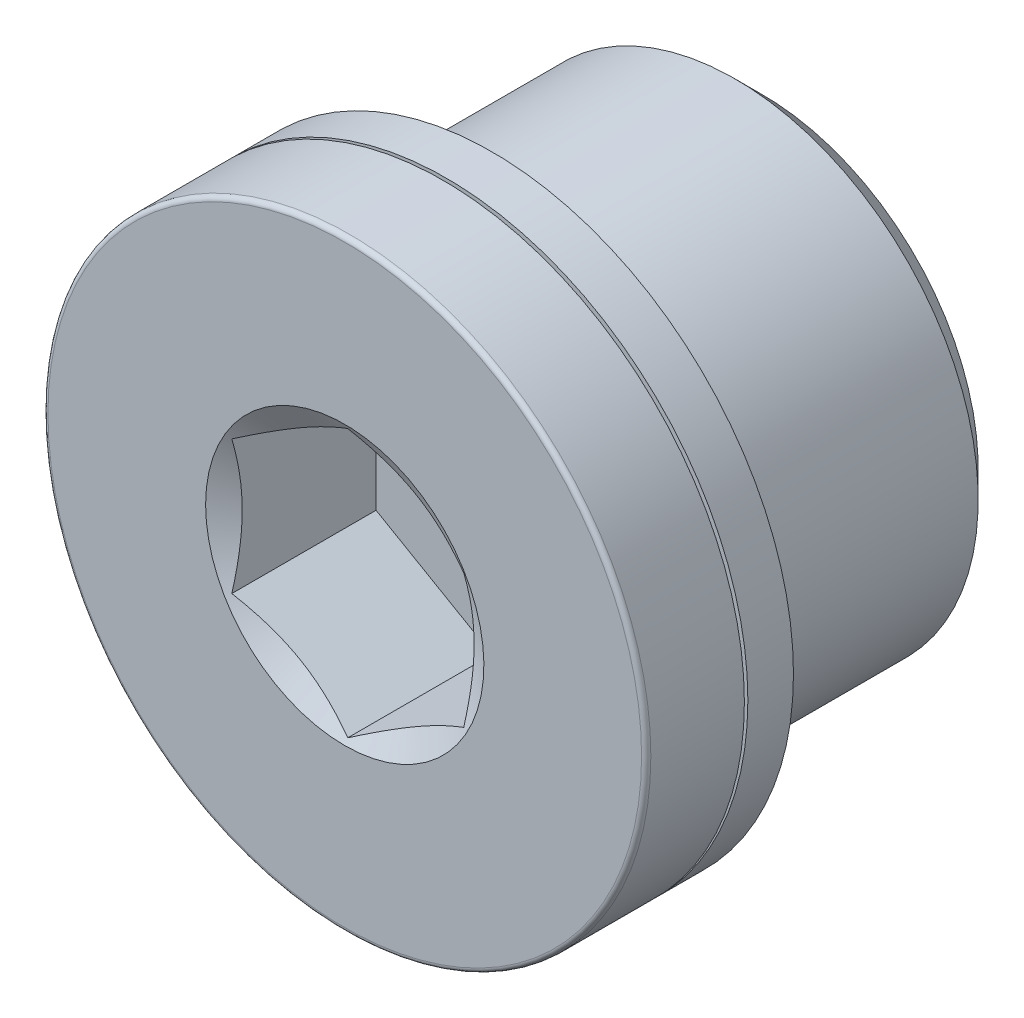
ISO-10303-21;
HEADER;
FILE_DESCRIPTION(('STEP AP214'),'2;1');
FILE_NAME('part.step','',(''),(''),'','','');
FILE_SCHEMA(('AUTOMOTIVE_DESIGN { 1 0 10303 214 1 1 1 1 }'));
ENDSEC;
DATA;
#1=APPLICATION_CONTEXT('core data for automotive mechanical design processes');
#2=APPLICATION_PROTOCOL_DEFINITION('international standard','automotive_design',2000,#1);
#3=PRODUCT_CONTEXT('',#1,'mechanical');
#4=PRODUCT('Part','Part','',(#3));
#5=PRODUCT_RELATED_PRODUCT_CATEGORY('part','',(#4));
#6=PRODUCT_DEFINITION_FORMATION('','',#4);
#7=PRODUCT_DEFINITION_CONTEXT('part definition',#1,'design');
#8=PRODUCT_DEFINITION('design','',#6,#7);
#9=PRODUCT_DEFINITION_SHAPE('','',#8);
#10=(LENGTH_UNIT() NAMED_UNIT(*) SI_UNIT(.MILLI.,.METRE.));
#11=(NAMED_UNIT(*) PLANE_ANGLE_UNIT() SI_UNIT($,.RADIAN.));
#12=(NAMED_UNIT(*) SI_UNIT($,.STERADIAN.) SOLID_ANGLE_UNIT());
#13=UNCERTAINTY_MEASURE_WITH_UNIT(LENGTH_MEASURE(1.E-05),#10,'distance_accuracy_value','');
#14=(GEOMETRIC_REPRESENTATION_CONTEXT(3) GLOBAL_UNCERTAINTY_ASSIGNED_CONTEXT((#13)) GLOBAL_UNIT_ASSIGNED_CONTEXT((#10,
#11,#12)) REPRESENTATION_CONTEXT('',''));
#15=CARTESIAN_POINT('',(0.,0.,0.));
#16=DIRECTION('',(0.,0.,1.));
#17=DIRECTION('',(1.,0.,0.));
#18=AXIS2_PLACEMENT_3D('',#15,#16,#17);
#19=CARTESIAN_POINT('',(0.,0.,2.88589838486224));
#20=DIRECTION('',(0.,0.,1.));
#21=DIRECTION('',(1.,0.,0.));
#22=AXIS2_PLACEMENT_3D('',#19,#20,#21);
#23=CONICAL_SURFACE('',#22,0.,1.0471975511966);
#24=CARTESIAN_POINT('',(0.,0.,6.35));
#25=DIRECTION('',(0.,0.,-1.));
#26=DIRECTION('',(-1.,0.,0.));
#27=AXIS2_PLACEMENT_3D('',#24,#25,#26);
#28=CIRCLE('',#27,6.);
#29=CARTESIAN_POINT('',(-6.,0.,6.35));
#30=VERTEX_POINT('',#29);
#31=EDGE_CURVE('E152',#30,#30,#28,.T.);
#32=ORIENTED_EDGE('',*,*,#31,.F.);
#33=EDGE_LOOP('',(#32));
#34=FACE_BOUND('',#33,.T.);
#35=CARTESIAN_POINT('',(-5.,-7.51498291576672,8.09726315250439));
#36=CARTESIAN_POINT('',(-5.,-7.29839682441269,7.9931853972235));
#37=CARTESIAN_POINT('',(-5.,-7.08128679067715,7.8901778184765));
#38=CARTESIAN_POINT('',(-5.,-6.64573899269538,7.6869106646106));
#39=CARTESIAN_POINT('',(-5.,-6.4273010008053,7.58665157786321));
#40=CARTESIAN_POINT('',(-5.,-5.98757322821237,7.38893249271981));
#41=CARTESIAN_POINT('',(-5.,-5.76627419510122,7.29149299495007));
#42=CARTESIAN_POINT('',(-5.,-5.32182876710889,7.10093846332174));
#43=CARTESIAN_POINT('',(-5.,-5.09868246827946,7.00782320626038));
#44=CARTESIAN_POINT('',(-5.,-4.64416259436984,6.82463959555632));
#45=CARTESIAN_POINT('',(-5.,-4.41272880244035,6.73471978137861));
#46=CARTESIAN_POINT('',(-5.,-3.94706741806007,6.56228336081755));
#47=CARTESIAN_POINT('',(-5.,-3.71283950408459,6.47976761592815));
#48=CARTESIAN_POINT('',(-5.,-3.24173832846906,6.32448137218276));
#49=CARTESIAN_POINT('',(-5.,-3.00487238668021,6.25168890461042));
#50=CARTESIAN_POINT('',(-5.,-2.52775604069386,6.11833937787826));
#51=CARTESIAN_POINT('',(-5.,-2.28750680326715,6.05777820603802));
#52=CARTESIAN_POINT('',(-5.,-1.80467662895432,5.95223314778336));
#53=CARTESIAN_POINT('',(-5.,-1.56211102340034,5.90718047816048));
#54=CARTESIAN_POINT('',(-5.,-1.07423325022016,5.83538707071728));
#55=CARTESIAN_POINT('',(-5.,-0.828921279391307,5.80864502923382));
#56=CARTESIAN_POINT('',(-5.,-0.339867234671963,5.77595532488155));
#57=CARTESIAN_POINT('',(-5.,-0.0961421499745084,5.76975964809213));
#58=CARTESIAN_POINT('',(-5.,0.390971712858013,5.77804856183829));
#59=CARTESIAN_POINT('',(-5.,0.634360470091799,5.79253438446762));
#60=CARTESIAN_POINT('',(-5.,1.05491312498942,5.83445216890555));
#61=CARTESIAN_POINT('',(-5.,1.23254199575583,5.85743855624536));
#62=CARTESIAN_POINT('',(-5.,1.58633032077231,5.91285916908837));
#63=CARTESIAN_POINT('',(-5.,1.76248953847734,5.94529488642275));
#64=CARTESIAN_POINT('',(-5.,2.28861525361025,6.05505238737444));
#65=CARTESIAN_POINT('',(-5.,2.63600942643604,6.14479982703772));
#66=CARTESIAN_POINT('',(-5.,3.15545267799602,6.29833259167404));
#67=CARTESIAN_POINT('',(-5.,3.33023614750218,6.35337541202317));
#68=CARTESIAN_POINT('',(-5.,3.67810293868774,6.46864160831348));
#69=CARTESIAN_POINT('',(-5.,3.8511862481301,6.528865021512));
#70=CARTESIAN_POINT('',(-5.,4.19572089434447,6.65357082288413));
#71=CARTESIAN_POINT('',(-5.,4.36717284596877,6.71805152734705));
#72=CARTESIAN_POINT('',(-5.,4.70869043500968,6.85056712253771));
#73=CARTESIAN_POINT('',(-5.,4.87875609600722,6.91860195266298));
#74=CARTESIAN_POINT('',(-5.,5.31566032178151,7.0978154516773));
#75=CARTESIAN_POINT('',(-5.,5.58159535709204,7.21119406765364));
#76=CARTESIAN_POINT('',(-5.,6.11103777091063,7.44350143076095));
#77=CARTESIAN_POINT('',(-5.,6.37454495892792,7.56243060902696));
#78=CARTESIAN_POINT('',(-5.,6.89965417045417,7.80457959466809));
#79=CARTESIAN_POINT('',(-5.,7.16125570501509,7.92780045934609));
#80=CARTESIAN_POINT('',(-5.,7.68286959339868,8.17756710133894));
#81=CARTESIAN_POINT('',(-5.,7.94288191064873,8.30411295481925));
#82=CARTESIAN_POINT('',(-5.,8.46192247473481,8.55998755665902));
#83=CARTESIAN_POINT('',(-5.,8.72094915014142,8.68931948707651));
#84=CARTESIAN_POINT('',(-5.,9.23793498576547,8.95010158025791));
#85=CARTESIAN_POINT('',(-5.,9.49589413699256,9.08155176081562));
#86=CARTESIAN_POINT('',(-5.,10.2683731632483,9.47841849938881));
#87=CARTESIAN_POINT('',(-5.,10.7815784831789,9.74639294927315));
#88=CARTESIAN_POINT('',(-5.,11.756570283339,10.2611299291552));
#89=CARTESIAN_POINT('',(-5.,12.2185806064612,10.507470284507));
#90=CARTESIAN_POINT('',(-5.,13.141115497133,11.0029645718297));
#91=CARTESIAN_POINT('',(-5.,13.6016399981462,11.2521186276124));
#92=CARTESIAN_POINT('',(-5.,14.5203444470608,11.7518767761664));
#93=CARTESIAN_POINT('',(-5.,14.9785273772632,12.0024753944819));
#94=CARTESIAN_POINT('',(-5.,15.8939640853943,12.5053003910811));
#95=CARTESIAN_POINT('',(-5.,16.3512179169289,12.7575266717331));
#96=CARTESIAN_POINT('',(-5.,16.8081395102917,13.0103498728431));
#97=B_SPLINE_CURVE_WITH_KNOTS('',3,(#35,#36,#37,#38,#39,#40,#41,#42,#43,#44,#45,#46,#47,#48,#49,
#50,#51,#52,#53,#54,#55,#56,#57,#58,#59,#60,#61,#62,#63,#64,#65,#66,#67,#68,#69,#70,#71,#72,#73,
#74,#75,#76,#77,#78,#79,#80,#81,#82,#83,#84,#85,#86,#87,#88,#89,#90,#91,#92,#93,#94,#95,#96),
.UNSPECIFIED.,.F.,.F.,(4,2,2,2,2,2,2,2,2,2,2,2,2,2,2,2,2,2,2,2,2,2,2,2,2,2,2,2,2,2,4),(0.,
0.72089525881937,1.44191779188295,2.16728388318506,2.89261249181733,3.637380209562,
4.38223447203014,5.12537627283443,5.86826778030699,6.60782063533198,7.34732083088114,
8.07786142952127,8.80844555170164,9.34551059163258,9.88266046773322,10.9576225694133,
11.5073200387208,12.0570214616248,12.606506771184,13.1559827143603,14.023177089919,
14.8904389365096,15.7579159750162,16.6254129021548,17.4939595114308,18.3625134205058,
20.0993402710273,21.6700733156475,23.2408757489962,24.8075826166374,26.37419636651),.UNSPECIFIED.);
#98=CARTESIAN_POINT('',(-5.,-2.88675134594813,6.21923171819558));
#99=VERTEX_POINT('',#98);
#100=CARTESIAN_POINT('',(-5.,2.88675134594813,6.21923171819558));
#101=VERTEX_POINT('',#100);
#102=EDGE_CURVE('E36',#99,#101,#97,.T.);
#103=ORIENTED_EDGE('',*,*,#102,.T.);
#104=CARTESIAN_POINT('',(-5.0002,2.88663587589429,6.21929838686221));
#105=CARTESIAN_POINT('',(-4.78046540547481,3.01349970319368,6.14603629844801));
#106=CARTESIAN_POINT('',(-4.55885141554042,3.14144859993849,6.07940105272847));
#107=CARTESIAN_POINT('',(-4.11178600454648,3.39956193532121,5.96308872182119));
#108=CARTESIAN_POINT('',(-3.88632664040922,3.52973095989718,5.91345278072616));
#109=CARTESIAN_POINT('',(-3.43816769477649,3.78847564779798,5.83620075622907));
#110=CARTESIAN_POINT('',(-3.2155379068958,3.91701101576052,5.80807010909387));
#111=CARTESIAN_POINT('',(-2.88081009815336,4.11026620624323,5.78284465276406));
#112=CARTESIAN_POINT('',(-2.76915780319494,4.17472868879311,5.77726319057986));
#113=CARTESIAN_POINT('',(-2.5457500293262,4.30371322717528,5.77185194756185));
#114=CARTESIAN_POINT('',(-2.43399455370968,4.36823528110589,5.77202198906858));
#115=CARTESIAN_POINT('',(-2.12781576914936,4.54500768479195,5.78040336260241));
#116=CARTESIAN_POINT('',(-1.93349391403278,4.65719946015293,5.79447950270763));
#117=CARTESIAN_POINT('',(-1.54613989800229,4.88083840557981,5.83911498791981));
#118=CARTESIAN_POINT('',(-1.35310909862843,4.9922847895602,5.86968959095789));
#119=CARTESIAN_POINT('',(-0.964974657525143,5.21637431361295,5.94611822443154));
#120=CARTESIAN_POINT('',(-0.769920001358262,5.32898917185759,5.99229610968906));
#121=CARTESIAN_POINT('',(-0.382719654641231,5.55253939626498,6.09710152530231));
#122=CARTESIAN_POINT('',(-0.190569004591913,5.66347762579592,6.15570443424775));
#123=CARTESIAN_POINT('',(0.000199999999999841,5.7736181619501,6.21929838686221));
#124=B_SPLINE_CURVE_WITH_KNOTS('',3,(#104,#105,#106,#107,#108,#109,#110,#111,#112,#113,#114,
#115,#116,#117,#118,#119,#120,#121,#122,#123),.UNSPECIFIED.,.F.,.F.,(4,2,2,2,2,2,2,2,2,4),(0.,
0.792555841363093,1.58701660053334,2.36181537487281,2.74884076077326,3.13585419177295,
3.8096236259968,4.48401723901189,5.17336882348929,5.86136694793725),.UNSPECIFIED.);
#125=CARTESIAN_POINT('',(0.,5.77350269189626,6.21923171819558));
#126=VERTEX_POINT('',#125);
#127=EDGE_CURVE('E13',#101,#126,#124,.T.);
#128=ORIENTED_EDGE('',*,*,#127,.T.);
#129=CARTESIAN_POINT('',(-0.0002,5.77361816195009,6.21929838686221));
#130=CARTESIAN_POINT('',(0.219534594525185,5.64675433465071,6.14603629844801));
#131=CARTESIAN_POINT('',(0.441148584459581,5.5188054379059,6.07940105272847));
#132=CARTESIAN_POINT('',(0.888213995453515,5.26069210252318,5.96308872182118));
#133=CARTESIAN_POINT('',(1.11367335959078,5.13052307794721,5.91345278072616));
#134=CARTESIAN_POINT('',(1.56183230522351,4.87177839004641,5.83620075622907));
#135=CARTESIAN_POINT('',(1.7844620931042,4.74324302208387,5.80807010909387));
#136=CARTESIAN_POINT('',(2.11918990184664,4.54998783160116,5.78284465276406));
#137=CARTESIAN_POINT('',(2.23084219680506,4.48552534905128,5.77726319057986));
#138=CARTESIAN_POINT('',(2.4542499706738,4.35654081066911,5.77185194756185));
#139=CARTESIAN_POINT('',(2.56600544629032,4.2920187567385,5.77202198906858));
#140=CARTESIAN_POINT('',(2.87218423085064,4.11524635305244,5.78040336260241));
#141=CARTESIAN_POINT('',(3.06650608596722,4.00305457769146,5.79447950270763));
#142=CARTESIAN_POINT('',(3.45386010199771,3.77941563226457,5.83911498791981));
#143=CARTESIAN_POINT('',(3.64689090137157,3.66796924828418,5.86968959095788));
#144=CARTESIAN_POINT('',(4.03502534247486,3.44387972423144,5.94611822443154));
#145=CARTESIAN_POINT('',(4.23007999864174,3.3312648659868,5.99229610968906));
#146=CARTESIAN_POINT('',(4.61728034535877,3.1077146415794,6.09710152530231));
#147=CARTESIAN_POINT('',(4.80943099540809,2.99677641204847,6.15570443424775));
#148=CARTESIAN_POINT('',(5.0002,2.88663587589429,6.21929838686221));
#149=B_SPLINE_CURVE_WITH_KNOTS('',3,(#129,#130,#131,#132,#133,#134,#135,#136,#137,#138,#139,
#140,#141,#142,#143,#144,#145,#146,#147,#148),.UNSPECIFIED.,.F.,.F.,(4,2,2,2,2,2,2,2,2,4),(0.,
0.792555841363093,1.58701660053334,2.36181537487281,2.74884076077326,3.13585419177295,
3.80962362599679,4.48401723901189,5.17336882348929,5.86136694793725),.UNSPECIFIED.);
#150=CARTESIAN_POINT('',(5.,2.88675134594813,6.21923171819558));
#151=VERTEX_POINT('',#150);
#152=EDGE_CURVE('E155',#126,#151,#149,.T.);
#153=ORIENTED_EDGE('',*,*,#152,.T.);
#154=CARTESIAN_POINT('',(5.,-7.51498291576672,8.09726315250439));
#155=CARTESIAN_POINT('',(5.,-7.29839682441269,7.9931853972235));
#156=CARTESIAN_POINT('',(5.,-7.08128679067715,7.8901778184765));
#157=CARTESIAN_POINT('',(5.,-6.64573899269538,7.6869106646106));
#158=CARTESIAN_POINT('',(5.,-6.4273010008053,7.58665157786321));
#159=CARTESIAN_POINT('',(5.,-5.98757322821237,7.38893249271981));
#160=CARTESIAN_POINT('',(5.,-5.76627419510122,7.29149299495007));
#161=CARTESIAN_POINT('',(5.,-5.32182876710889,7.10093846332174));
#162=CARTESIAN_POINT('',(5.,-5.09868246827946,7.00782320626038));
#163=CARTESIAN_POINT('',(5.,-4.64416259436984,6.82463959555632));
#164=CARTESIAN_POINT('',(5.,-4.41272880244035,6.73471978137861));
#165=CARTESIAN_POINT('',(5.,-3.94706741806007,6.56228336081755));
#166=CARTESIAN_POINT('',(5.,-3.71283950408459,6.47976761592815));
#167=CARTESIAN_POINT('',(5.,-3.24173832846906,6.32448137218276));
#168=CARTESIAN_POINT('',(5.,-3.00487238668021,6.25168890461042));
#169=CARTESIAN_POINT('',(5.,-2.52775604069386,6.11833937787826));
#170=CARTESIAN_POINT('',(5.,-2.28750680326715,6.05777820603802));
#171=CARTESIAN_POINT('',(5.,-1.80467662895432,5.95223314778336));
#172=CARTESIAN_POINT('',(5.,-1.56211102340034,5.90718047816048));
#173=CARTESIAN_POINT('',(5.,-1.07423325022016,5.83538707071728));
#174=CARTESIAN_POINT('',(5.,-0.828921279391307,5.80864502923382));
#175=CARTESIAN_POINT('',(5.,-0.339867234671963,5.77595532488155));
#176=CARTESIAN_POINT('',(5.,-0.0961421499745084,5.76975964809213));
#177=CARTESIAN_POINT('',(5.,0.390971712858013,5.77804856183829));
#178=CARTESIAN_POINT('',(5.,0.634360470091799,5.79253438446762));
#179=CARTESIAN_POINT('',(5.,1.05491312498942,5.83445216890555));
#180=CARTESIAN_POINT('',(5.,1.23254199575583,5.85743855624536));
#181=CARTESIAN_POINT('',(5.,1.58633032077231,5.91285916908837));
#182=CARTESIAN_POINT('',(5.,1.76248953847734,5.94529488642275));
#183=CARTESIAN_POINT('',(5.,2.28861525361025,6.05505238737444));
#184=CARTESIAN_POINT('',(5.,2.63600942643604,6.14479982703772));
#185=CARTESIAN_POINT('',(5.,3.15545267799602,6.29833259167404));
#186=CARTESIAN_POINT('',(5.,3.33023614750218,6.35337541202317));
#187=CARTESIAN_POINT('',(5.,3.67810293868774,6.46864160831348));
#188=CARTESIAN_POINT('',(5.,3.8511862481301,6.528865021512));
#189=CARTESIAN_POINT('',(5.,4.19572089434447,6.65357082288413));
#190=CARTESIAN_POINT('',(5.,4.36717284596877,6.71805152734705));
#191=CARTESIAN_POINT('',(5.,4.70869043500968,6.85056712253771));
#192=CARTESIAN_POINT('',(5.,4.87875609600722,6.91860195266298));
#193=CARTESIAN_POINT('',(5.,5.31566032178151,7.0978154516773));
#194=CARTESIAN_POINT('',(5.,5.58159535709204,7.21119406765364));
#195=CARTESIAN_POINT('',(5.,6.11103777091063,7.44350143076095));
#196=CARTESIAN_POINT('',(5.,6.37454495892792,7.56243060902696));
#197=CARTESIAN_POINT('',(5.,6.89965417045417,7.80457959466809));
#198=CARTESIAN_POINT('',(5.,7.16125570501509,7.92780045934609));
#199=CARTESIAN_POINT('',(5.,7.68286959339868,8.17756710133894));
#200=CARTESIAN_POINT('',(5.,7.94288191064873,8.30411295481925));
#201=CARTESIAN_POINT('',(5.,8.46192247473481,8.55998755665902));
#202=CARTESIAN_POINT('',(5.,8.72094915014142,8.68931948707651));
#203=CARTESIAN_POINT('',(5.,9.23793498576547,8.95010158025791));
#204=CARTESIAN_POINT('',(5.,9.49589413699256,9.08155176081562));
#205=CARTESIAN_POINT('',(5.,10.2683731632483,9.47841849938881));
#206=CARTESIAN_POINT('',(5.,10.7815784831789,9.74639294927315));
#207=CARTESIAN_POINT('',(5.,11.756570283339,10.2611299291552));
#208=CARTESIAN_POINT('',(5.,12.2185806064612,10.507470284507));
#209=CARTESIAN_POINT('',(5.,13.141115497133,11.0029645718297));
#210=CARTESIAN_POINT('',(5.,13.6016399981462,11.2521186276124));
#211=CARTESIAN_POINT('',(5.,14.5203444470608,11.7518767761664));
#212=CARTESIAN_POINT('',(5.,14.9785273772632,12.0024753944819));
#213=CARTESIAN_POINT('',(5.,15.8939640853943,12.5053003910811));
#214=CARTESIAN_POINT('',(5.,16.3512179169289,12.7575266717331));
#215=CARTESIAN_POINT('',(5.,16.8081395102917,13.0103498728431));
#216=B_SPLINE_CURVE_WITH_KNOTS('',3,(#154,#155,#156,#157,#158,#159,#160,#161,#162,#163,#164,
#165,#166,#167,#168,#169,#170,#171,#172,#173,#174,#175,#176,#177,#178,#179,#180,#181,#182,#183,
#184,#185,#186,#187,#188,#189,#190,#191,#192,#193,#194,#195,#196,#197,#198,#199,#200,#201,#202,
#203,#204,#205,#206,#207,#208,#209,#210,#211,#212,#213,#214,#215),.UNSPECIFIED.,.F.,.F.,(4,2,2,
2,2,2,2,2,2,2,2,2,2,2,2,2,2,2,2,2,2,2,2,2,2,2,2,2,2,2,4),(0.,0.72089525881937,1.44191779188295,
2.16728388318506,2.89261249181733,3.637380209562,4.38223447203014,5.12537627283443,
5.86826778030699,6.60782063533198,7.34732083088114,8.07786142952127,8.80844555170164,
9.34551059163258,9.88266046773322,10.9576225694133,11.5073200387208,12.0570214616248,
12.606506771184,13.1559827143603,14.023177089919,14.8904389365096,15.7579159750162,
16.6254129021548,17.4939595114308,18.3625134205058,20.0993402710273,21.6700733156475,
23.2408757489962,24.8075826166374,26.37419636651),.UNSPECIFIED.);
#217=CARTESIAN_POINT('',(5.,-2.88675134594813,6.21923171819558));
#218=VERTEX_POINT('',#217);
#219=EDGE_CURVE('E162',#151,#218,#216,.F.);
#220=ORIENTED_EDGE('',*,*,#219,.T.);
#221=CARTESIAN_POINT('',(5.0002,-2.88663587589429,6.21929838686221));
#222=CARTESIAN_POINT('',(4.78046540547481,-3.01349970319368,6.14603629844801));
#223=CARTESIAN_POINT('',(4.55885141554042,-3.14144859993849,6.07940105272847));
#224=CARTESIAN_POINT('',(4.11178600454648,-3.39956193532121,5.96308872182119));
#225=CARTESIAN_POINT('',(3.88632664040922,-3.52973095989718,5.91345278072616));
#226=CARTESIAN_POINT('',(3.43816769477649,-3.78847564779798,5.83620075622907));
#227=CARTESIAN_POINT('',(3.2155379068958,-3.91701101576052,5.80807010909387));
#228=CARTESIAN_POINT('',(2.88081009815336,-4.11026620624323,5.78284465276406));
#229=CARTESIAN_POINT('',(2.76915780319494,-4.17472868879311,5.77726319057986));
#230=CARTESIAN_POINT('',(2.5457500293262,-4.30371322717528,5.77185194756185));
#231=CARTESIAN_POINT('',(2.43399455370968,-4.36823528110589,5.77202198906858));
#232=CARTESIAN_POINT('',(2.12781576914936,-4.54500768479195,5.78040336260241));
#233=CARTESIAN_POINT('',(1.93349391403278,-4.65719946015293,5.79447950270763));
#234=CARTESIAN_POINT('',(1.54613989800229,-4.88083840557981,5.83911498791981));
#235=CARTESIAN_POINT('',(1.35310909862843,-4.9922847895602,5.86968959095789));
#236=CARTESIAN_POINT('',(0.964974657525143,-5.21637431361295,5.94611822443154));
#237=CARTESIAN_POINT('',(0.769920001358262,-5.32898917185759,5.99229610968906));
#238=CARTESIAN_POINT('',(0.382719654641231,-5.55253939626498,6.09710152530231));
#239=CARTESIAN_POINT('',(0.190569004591913,-5.66347762579592,6.15570443424775));
#240=CARTESIAN_POINT('',(-0.000199999999999841,-5.7736181619501,6.21929838686221));
#241=B_SPLINE_CURVE_WITH_KNOTS('',3,(#221,#222,#223,#224,#225,#226,#227,#228,#229,#230,#231,
#232,#233,#234,#235,#236,#237,#238,#239,#240),.UNSPECIFIED.,.F.,.F.,(4,2,2,2,2,2,2,2,2,4),(0.,
0.792555841363093,1.58701660053334,2.36181537487281,2.74884076077326,3.13585419177295,
3.8096236259968,4.48401723901189,5.17336882348929,5.86136694793725),.UNSPECIFIED.);
#242=CARTESIAN_POINT('',(0.,-5.77350269189626,6.21923171819558));
#243=VERTEX_POINT('',#242);
#244=EDGE_CURVE('E185',#218,#243,#241,.T.);
#245=ORIENTED_EDGE('',*,*,#244,.T.);
#246=CARTESIAN_POINT('',(0.0002,-5.77361816195009,6.21929838686221));
#247=CARTESIAN_POINT('',(-0.219534594525185,-5.64675433465071,6.14603629844801));
#248=CARTESIAN_POINT('',(-0.441148584459581,-5.5188054379059,6.07940105272847));
#249=CARTESIAN_POINT('',(-0.888213995453515,-5.26069210252318,5.96308872182118));
#250=CARTESIAN_POINT('',(-1.11367335959078,-5.13052307794721,5.91345278072616));
#251=CARTESIAN_POINT('',(-1.56183230522351,-4.87177839004641,5.83620075622907));
#252=CARTESIAN_POINT('',(-1.7844620931042,-4.74324302208387,5.80807010909387));
#253=CARTESIAN_POINT('',(-2.11918990184664,-4.54998783160116,5.78284465276406));
#254=CARTESIAN_POINT('',(-2.23084219680506,-4.48552534905128,5.77726319057986));
#255=CARTESIAN_POINT('',(-2.4542499706738,-4.35654081066911,5.77185194756185));
#256=CARTESIAN_POINT('',(-2.56600544629032,-4.2920187567385,5.77202198906858));
#257=CARTESIAN_POINT('',(-2.87218423085064,-4.11524635305244,5.78040336260241));
#258=CARTESIAN_POINT('',(-3.06650608596722,-4.00305457769146,5.79447950270763));
#259=CARTESIAN_POINT('',(-3.45386010199771,-3.77941563226457,5.83911498791981));
#260=CARTESIAN_POINT('',(-3.64689090137157,-3.66796924828418,5.86968959095788));
#261=CARTESIAN_POINT('',(-4.03502534247486,-3.44387972423144,5.94611822443154));
#262=CARTESIAN_POINT('',(-4.23007999864174,-3.3312648659868,5.99229610968906));
#263=CARTESIAN_POINT('',(-4.61728034535877,-3.1077146415794,6.09710152530231));
#264=CARTESIAN_POINT('',(-4.80943099540809,-2.99677641204847,6.15570443424775));
#265=CARTESIAN_POINT('',(-5.0002,-2.88663587589429,6.21929838686221));
#266=B_SPLINE_CURVE_WITH_KNOTS('',3,(#246,#247,#248,#249,#250,#251,#252,#253,#254,#255,#256,
#257,#258,#259,#260,#261,#262,#263,#264,#265),.UNSPECIFIED.,.F.,.F.,(4,2,2,2,2,2,2,2,2,4),(0.,
0.792555841363093,1.58701660053334,2.36181537487281,2.74884076077326,3.13585419177295,
3.80962362599679,4.48401723901189,5.17336882348929,5.86136694793725),.UNSPECIFIED.);
#267=EDGE_CURVE('E191',#243,#99,#266,.T.);
#268=ORIENTED_EDGE('',*,*,#267,.T.);
#269=EDGE_LOOP('',(#103,#128,#153,#220,#245,#268));
#270=FACE_BOUND('',#269,.T.);
#271=ADVANCED_FACE('F24',(#34,#270),#23,.F.);
#272=CARTESIAN_POINT('',(0.,6.,6.35));
#273=DIRECTION('',(0.,0.,-1.));
#274=DIRECTION('',(-1.,0.,0.));
#275=AXIS2_PLACEMENT_3D('',#272,#273,#274);
#276=PLANE('',#275);
#277=CARTESIAN_POINT('',(0.,0.,6.35));
#278=DIRECTION('',(0.,0.,-1.));
#279=DIRECTION('',(-1.,0.,0.));
#280=AXIS2_PLACEMENT_3D('',#277,#278,#279);
#281=CIRCLE('',#280,12.8);
#282=CARTESIAN_POINT('',(-12.8,0.,6.35));
#283=VERTEX_POINT('',#282);
#284=EDGE_CURVE('E149',#283,#283,#281,.T.);
#285=ORIENTED_EDGE('',*,*,#284,.F.);
#286=EDGE_LOOP('',(#285));
#287=FACE_BOUND('',#286,.T.);
#288=ORIENTED_EDGE('',*,*,#31,.T.);
#289=EDGE_LOOP('',(#288));
#290=FACE_BOUND('',#289,.T.);
#291=ADVANCED_FACE('F246',(#287,#290),#276,.F.);
#292=CARTESIAN_POINT('',(0.,0.,6.15));
#293=DIRECTION('',(0.,0.,-1.));
#294=DIRECTION('',(-1.,0.,0.));
#295=AXIS2_PLACEMENT_3D('',#292,#293,#294);
#296=TOROIDAL_SURFACE('',#295,12.8,0.2);
#297=ORIENTED_EDGE('',*,*,#284,.T.);
#298=EDGE_LOOP('',(#297));
#299=FACE_BOUND('',#298,.T.);
#300=CARTESIAN_POINT('',(0.,0.,6.15));
#301=DIRECTION('',(0.,0.,-1.));
#302=DIRECTION('',(-1.,0.,0.));
#303=AXIS2_PLACEMENT_3D('',#300,#301,#302);
#304=CIRCLE('',#303,13.);
#305=CARTESIAN_POINT('',(-13.,0.,6.15));
#306=VERTEX_POINT('',#305);
#307=EDGE_CURVE('E146',#306,#306,#304,.T.);
#308=ORIENTED_EDGE('',*,*,#307,.F.);
#309=EDGE_LOOP('',(#308));
#310=FACE_BOUND('',#309,.T.);
#311=ADVANCED_FACE('F243',(#299,#310),#296,.T.);
#312=CARTESIAN_POINT('',(0.,0.,-11.65));
#313=DIRECTION('',(0.,0.,-1.));
#314=DIRECTION('',(-1.,0.,0.));
#315=AXIS2_PLACEMENT_3D('',#312,#313,#314);
#316=CYLINDRICAL_SURFACE('',#315,13.);
#317=CARTESIAN_POINT('',(0.,0.,2.11666666666667));
#318=DIRECTION('',(0.,0.,-1.));
#319=DIRECTION('',(-1.,0.,0.));
#320=AXIS2_PLACEMENT_3D('',#317,#318,#319);
#321=CIRCLE('',#320,13.);
#322=CARTESIAN_POINT('',(-13.,0.,2.11666666666667));
#323=VERTEX_POINT('',#322);
#324=EDGE_CURVE('E143',#323,#323,#321,.T.);
#325=ORIENTED_EDGE('',*,*,#324,.F.);
#326=EDGE_LOOP('',(#325));
#327=FACE_BOUND('',#326,.T.);
#328=ORIENTED_EDGE('',*,*,#307,.T.);
#329=EDGE_LOOP('',(#328));
#330=FACE_BOUND('',#329,.T.);
#331=ADVANCED_FACE('F239',(#327,#330),#316,.T.);
#332=CARTESIAN_POINT('',(0.,13.,2.11666666666667));
#333=DIRECTION('',(0.,0.,1.));
#334=DIRECTION('',(1.,0.,0.));
#335=AXIS2_PLACEMENT_3D('',#332,#333,#334);
#336=PLANE('',#335);
#337=CARTESIAN_POINT('',(0.,0.,2.11666666666667));
#338=DIRECTION('',(0.,0.,-1.));
#339=DIRECTION('',(-1.,0.,0.));
#340=AXIS2_PLACEMENT_3D('',#337,#338,#339);
#341=CIRCLE('',#340,11.7);
#342=CARTESIAN_POINT('',(-11.7,0.,2.11666666666667));
#343=VERTEX_POINT('',#342);
#344=EDGE_CURVE('E140',#343,#343,#341,.T.);
#345=ORIENTED_EDGE('',*,*,#344,.F.);
#346=EDGE_LOOP('',(#345));
#347=FACE_BOUND('',#346,.T.);
#348=ORIENTED_EDGE('',*,*,#324,.T.);
#349=EDGE_LOOP('',(#348));
#350=FACE_BOUND('',#349,.T.);
#351=ADVANCED_FACE('F235',(#347,#350),#336,.F.);
#352=CARTESIAN_POINT('',(0.,0.,-11.65));
#353=DIRECTION('',(0.,0.,-1.));
#354=DIRECTION('',(-1.,0.,0.));
#355=AXIS2_PLACEMENT_3D('',#352,#353,#354);
#356=CYLINDRICAL_SURFACE('',#355,11.7);
#357=CARTESIAN_POINT('',(0.,0.,1.96666666666667));
#358=DIRECTION('',(0.,0.,-1.));
#359=DIRECTION('',(-1.,0.,0.));
#360=AXIS2_PLACEMENT_3D('',#357,#358,#359);
#361=CIRCLE('',#360,11.7);
#362=CARTESIAN_POINT('',(-11.7,0.,1.96666666666667));
#363=VERTEX_POINT('',#362);
#364=EDGE_CURVE('E137',#363,#363,#361,.T.);
#365=ORIENTED_EDGE('',*,*,#364,.F.);
#366=EDGE_LOOP('',(#365));
#367=FACE_BOUND('',#366,.T.);
#368=ORIENTED_EDGE('',*,*,#344,.T.);
#369=EDGE_LOOP('',(#368));
#370=FACE_BOUND('',#369,.T.);
#371=ADVANCED_FACE('F231',(#367,#370),#356,.T.);
#372=CARTESIAN_POINT('',(0.,11.7,1.96666666666667));
#373=DIRECTION('',(0.,0.,-1.));
#374=DIRECTION('',(-1.,0.,0.));
#375=AXIS2_PLACEMENT_3D('',#372,#373,#374);
#376=PLANE('',#375);
#377=CARTESIAN_POINT('',(0.,0.,1.96666666666667));
#378=DIRECTION('',(0.,0.,-1.));
#379=DIRECTION('',(-1.,0.,0.));
#380=AXIS2_PLACEMENT_3D('',#377,#378,#379);
#381=CIRCLE('',#380,13.);
#382=CARTESIAN_POINT('',(-13.,0.,1.96666666666667));
#383=VERTEX_POINT('',#382);
#384=EDGE_CURVE('E134',#383,#383,#381,.T.);
#385=ORIENTED_EDGE('',*,*,#384,.F.);
#386=EDGE_LOOP('',(#385));
#387=FACE_BOUND('',#386,.T.);
#388=ORIENTED_EDGE('',*,*,#364,.T.);
#389=EDGE_LOOP('',(#388));
#390=FACE_BOUND('',#389,.T.);
#391=ADVANCED_FACE('F227',(#387,#390),#376,.F.);
#392=CARTESIAN_POINT('',(0.,0.,-11.65));
#393=DIRECTION('',(0.,0.,-1.));
#394=DIRECTION('',(-1.,0.,0.));
#395=AXIS2_PLACEMENT_3D('',#392,#393,#394);
#396=CYLINDRICAL_SURFACE('',#395,13.);
#397=CARTESIAN_POINT('',(0.,0.,0.));
#398=DIRECTION('',(0.,0.,-1.));
#399=DIRECTION('',(-1.,0.,0.));
#400=AXIS2_PLACEMENT_3D('',#397,#398,#399);
#401=CIRCLE('',#400,13.);
#402=CARTESIAN_POINT('',(-13.,0.,0.));
#403=VERTEX_POINT('',#402);
#404=EDGE_CURVE('E131',#403,#403,#401,.T.);
#405=ORIENTED_EDGE('',*,*,#404,.F.);
#406=EDGE_LOOP('',(#405));
#407=FACE_BOUND('',#406,.T.);
#408=ORIENTED_EDGE('',*,*,#384,.T.);
#409=EDGE_LOOP('',(#408));
#410=FACE_BOUND('',#409,.T.);
#411=ADVANCED_FACE('F223',(#407,#410),#396,.T.);
#412=CARTESIAN_POINT('',(0.,13.,0.));
#413=DIRECTION('',(0.,0.,1.));
#414=DIRECTION('',(1.,0.,0.));
#415=AXIS2_PLACEMENT_3D('',#412,#413,#414);
#416=PLANE('',#415);
#417=CARTESIAN_POINT('',(0.,0.,0.));
#418=DIRECTION('',(0.,0.,-1.));
#419=DIRECTION('',(-1.,0.,0.));
#420=AXIS2_PLACEMENT_3D('',#417,#418,#419);
#421=CIRCLE('',#420,9.3155);
#422=CARTESIAN_POINT('',(-9.3155,0.,0.));
#423=VERTEX_POINT('',#422);
#424=EDGE_CURVE('E128',#423,#423,#421,.T.);
#425=ORIENTED_EDGE('',*,*,#424,.F.);
#426=EDGE_LOOP('',(#425));
#427=FACE_BOUND('',#426,.T.);
#428=ORIENTED_EDGE('',*,*,#404,.T.);
#429=EDGE_LOOP('',(#428));
#430=FACE_BOUND('',#429,.T.);
#431=ADVANCED_FACE('F219',(#427,#430),#416,.F.);
#432=CARTESIAN_POINT('',(0.,0.,0.));
#433=DIRECTION('',(0.,0.,-1.));
#434=DIRECTION('',(-1.,0.,0.));
#435=AXIS2_PLACEMENT_3D('',#432,#433,#434);
#436=CONICAL_SURFACE('',#435,9.3155,0.785398163397448);
#437=CARTESIAN_POINT('',(0.,0.,-1.162));
#438=DIRECTION('',(0.,0.,-1.));
#439=DIRECTION('',(-1.,0.,0.));
#440=AXIS2_PLACEMENT_3D('',#437,#438,#439);
#441=CIRCLE('',#440,10.4775);
#442=CARTESIAN_POINT('',(-10.4775,0.,-1.162));
#443=VERTEX_POINT('',#442);
#444=EDGE_CURVE('E125',#443,#443,#441,.T.);
#445=ORIENTED_EDGE('',*,*,#444,.F.);
#446=EDGE_LOOP('',(#445));
#447=FACE_BOUND('',#446,.T.);
#448=ORIENTED_EDGE('',*,*,#424,.T.);
#449=EDGE_LOOP('',(#448));
#450=FACE_BOUND('',#449,.T.);
#451=ADVANCED_FACE('F215',(#447,#450),#436,.T.);
#452=CARTESIAN_POINT('',(0.,0.,-11.65));
#453=DIRECTION('',(0.,0.,-1.));
#454=DIRECTION('',(-1.,0.,0.));
#455=AXIS2_PLACEMENT_3D('',#452,#453,#454);
#456=CYLINDRICAL_SURFACE('',#455,10.4775);
#457=CARTESIAN_POINT('',(0.,0.,-10.488));
#458=DIRECTION('',(0.,0.,-1.));
#459=DIRECTION('',(-1.,0.,0.));
#460=AXIS2_PLACEMENT_3D('',#457,#458,#459);
#461=CIRCLE('',#460,10.4775);
#462=CARTESIAN_POINT('',(-10.4775,0.,-10.488));
#463=VERTEX_POINT('',#462);
#464=EDGE_CURVE('E122',#463,#463,#461,.T.);
#465=ORIENTED_EDGE('',*,*,#464,.F.);
#466=EDGE_LOOP('',(#465));
#467=FACE_BOUND('',#466,.T.);
#468=ORIENTED_EDGE('',*,*,#444,.T.);
#469=EDGE_LOOP('',(#468));
#470=FACE_BOUND('',#469,.T.);
#471=ADVANCED_FACE('F211',(#467,#470),#456,.T.);
#472=CARTESIAN_POINT('',(0.,0.,-10.488));
#473=DIRECTION('',(0.,0.,1.));
#474=DIRECTION('',(1.,0.,0.));
#475=AXIS2_PLACEMENT_3D('',#472,#473,#474);
#476=CONICAL_SURFACE('',#475,10.4775,0.785398163397448);
#477=CARTESIAN_POINT('',(0.,0.,-11.65));
#478=DIRECTION('',(0.,0.,-1.));
#479=DIRECTION('',(-1.,0.,0.));
#480=AXIS2_PLACEMENT_3D('',#477,#478,#479);
#481=CIRCLE('',#480,9.3155);
#482=CARTESIAN_POINT('',(-9.3155,0.,-11.65));
#483=VERTEX_POINT('',#482);
#484=EDGE_CURVE('E85',#483,#483,#481,.T.);
#485=ORIENTED_EDGE('',*,*,#484,.F.);
#486=EDGE_LOOP('',(#485));
#487=FACE_BOUND('',#486,.T.);
#488=ORIENTED_EDGE('',*,*,#464,.T.);
#489=EDGE_LOOP('',(#488));
#490=FACE_BOUND('',#489,.T.);
#491=ADVANCED_FACE('F207',(#487,#490),#476,.T.);
#492=CARTESIAN_POINT('',(0.,9.3155,-11.65));
#493=DIRECTION('',(0.,0.,1.));
#494=DIRECTION('',(1.,0.,0.));
#495=AXIS2_PLACEMENT_3D('',#492,#493,#494);
#496=PLANE('',#495);
#497=ORIENTED_EDGE('',*,*,#484,.T.);
#498=EDGE_LOOP('',(#497));
#499=FACE_BOUND('',#498,.T.);
#500=ADVANCED_FACE('F204',(#499),#496,.F.);
#501=CARTESIAN_POINT('',(0.,5.77350269189626,0.));
#502=DIRECTION('',(-0.5,0.866025403784439,0.));
#503=DIRECTION('',(-0.866025403784439,-0.5,0.));
#504=AXIS2_PLACEMENT_3D('',#501,#502,#503);
#505=PLANE('',#504);
#506=DIRECTION('',(0.,0.,1.));
#507=VECTOR('',#506,1.);
#508=CARTESIAN_POINT('',(-5.,2.88675134594813,0.));
#509=LINE('',#508,#507);
#510=CARTESIAN_POINT('',(-5.,2.88675134594813,0.));
#511=VERTEX_POINT('',#510);
#512=EDGE_CURVE('E78',#511,#101,#509,.T.);
#513=ORIENTED_EDGE('',*,*,#512,.F.);
#514=DIRECTION('',(-0.866025403784439,-0.5,0.));
#515=VECTOR('',#514,1.);
#516=CARTESIAN_POINT('',(0.,5.77350269189626,0.));
#517=LINE('',#516,#515);
#518=CARTESIAN_POINT('',(0.,5.77350269189626,0.));
#519=VERTEX_POINT('',#518);
#520=EDGE_CURVE('E82',#519,#511,#517,.T.);
#521=ORIENTED_EDGE('',*,*,#520,.F.);
#522=DIRECTION('',(0.,0.,1.));
#523=VECTOR('',#522,1.);
#524=CARTESIAN_POINT('',(0.,5.77350269189626,0.));
#525=LINE('',#524,#523);
#526=EDGE_CURVE('E110',#519,#126,#525,.T.);
#527=ORIENTED_EDGE('',*,*,#526,.T.);
#528=ORIENTED_EDGE('',*,*,#127,.F.);
#529=EDGE_LOOP('',(#513,#521,#527,#528));
#530=FACE_BOUND('',#529,.T.);
#531=ADVANCED_FACE('F80',(#530),#505,.F.);
#532=CARTESIAN_POINT('',(-5.,2.88675134594813,0.));
#533=DIRECTION('',(-1.,0.,0.));
#534=DIRECTION('',(0.,0.,1.));
#535=AXIS2_PLACEMENT_3D('',#532,#533,#534);
#536=PLANE('',#535);
#537=DIRECTION('',(0.,0.,1.));
#538=VECTOR('',#537,1.);
#539=CARTESIAN_POINT('',(-5.,-2.88675134594813,0.));
#540=LINE('',#539,#538);
#541=CARTESIAN_POINT('',(-5.,-2.88675134594813,0.));
#542=VERTEX_POINT('',#541);
#543=EDGE_CURVE('E86',#542,#99,#540,.T.);
#544=ORIENTED_EDGE('',*,*,#543,.F.);
#545=DIRECTION('',(0.,-1.,0.));
#546=VECTOR('',#545,1.);
#547=CARTESIAN_POINT('',(-5.,2.88675134594813,0.));
#548=LINE('',#547,#546);
#549=EDGE_CURVE('E89',#511,#542,#548,.T.);
#550=ORIENTED_EDGE('',*,*,#549,.F.);
#551=ORIENTED_EDGE('',*,*,#512,.T.);
#552=ORIENTED_EDGE('',*,*,#102,.F.);
#553=EDGE_LOOP('',(#544,#550,#551,#552));
#554=FACE_BOUND('',#553,.T.);
#555=ADVANCED_FACE('F90',(#554),#536,.F.);
#556=CARTESIAN_POINT('',(-5.,-2.88675134594813,0.));
#557=DIRECTION('',(-0.5,-0.866025403784439,0.));
#558=DIRECTION('',(0.866025403784439,-0.5,0.));
#559=AXIS2_PLACEMENT_3D('',#556,#557,#558);
#560=PLANE('',#559);
#561=DIRECTION('',(0.,0.,1.));
#562=VECTOR('',#561,1.);
#563=CARTESIAN_POINT('',(0.,-5.77350269189626,0.));
#564=LINE('',#563,#562);
#565=CARTESIAN_POINT('',(0.,-5.77350269189626,0.));
#566=VERTEX_POINT('',#565);
#567=EDGE_CURVE('E116',#566,#243,#564,.T.);
#568=ORIENTED_EDGE('',*,*,#567,.F.);
#569=DIRECTION('',(0.866025403784439,-0.5,0.));
#570=VECTOR('',#569,1.);
#571=CARTESIAN_POINT('',(-5.,-2.88675134594813,0.));
#572=LINE('',#571,#570);
#573=EDGE_CURVE('E95',#542,#566,#572,.T.);
#574=ORIENTED_EDGE('',*,*,#573,.F.);
#575=ORIENTED_EDGE('',*,*,#543,.T.);
#576=ORIENTED_EDGE('',*,*,#267,.F.);
#577=EDGE_LOOP('',(#568,#574,#575,#576));
#578=FACE_BOUND('',#577,.T.);
#579=ADVANCED_FACE('F181',(#578),#560,.F.);
#580=CARTESIAN_POINT('',(0.,-5.77350269189626,0.));
#581=DIRECTION('',(0.5,-0.866025403784439,0.));
#582=DIRECTION('',(0.866025403784439,0.5,0.));
#583=AXIS2_PLACEMENT_3D('',#580,#581,#582);
#584=PLANE('',#583);
#585=DIRECTION('',(0.,0.,1.));
#586=VECTOR('',#585,1.);
#587=CARTESIAN_POINT('',(5.,-2.88675134594813,0.));
#588=LINE('',#587,#586);
#589=CARTESIAN_POINT('',(5.,-2.88675134594813,0.));
#590=VERTEX_POINT('',#589);
#591=EDGE_CURVE('E113',#590,#218,#588,.T.);
#592=ORIENTED_EDGE('',*,*,#591,.F.);
#593=DIRECTION('',(0.866025403784439,0.5,0.));
#594=VECTOR('',#593,1.);
#595=CARTESIAN_POINT('',(0.,-5.77350269189626,0.));
#596=LINE('',#595,#594);
#597=EDGE_CURVE('E104',#566,#590,#596,.T.);
#598=ORIENTED_EDGE('',*,*,#597,.F.);
#599=ORIENTED_EDGE('',*,*,#567,.T.);
#600=ORIENTED_EDGE('',*,*,#244,.F.);
#601=EDGE_LOOP('',(#592,#598,#599,#600));
#602=FACE_BOUND('',#601,.T.);
#603=ADVANCED_FACE('F176',(#602),#584,.F.);
#604=CARTESIAN_POINT('',(5.,-2.88675134594813,0.));
#605=DIRECTION('',(1.,0.,0.));
#606=DIRECTION('',(0.,0.,-1.));
#607=AXIS2_PLACEMENT_3D('',#604,#605,#606);
#608=PLANE('',#607);
#609=DIRECTION('',(0.,0.,1.));
#610=VECTOR('',#609,1.);
#611=CARTESIAN_POINT('',(5.,2.88675134594813,0.));
#612=LINE('',#611,#610);
#613=CARTESIAN_POINT('',(5.,2.88675134594813,0.));
#614=VERTEX_POINT('',#613);
#615=EDGE_CURVE('E43',#614,#151,#612,.T.);
#616=ORIENTED_EDGE('',*,*,#615,.F.);
#617=DIRECTION('',(0.,1.,0.));
#618=VECTOR('',#617,1.);
#619=CARTESIAN_POINT('',(5.,-2.88675134594813,0.));
#620=LINE('',#619,#618);
#621=EDGE_CURVE('E107',#590,#614,#620,.T.);
#622=ORIENTED_EDGE('',*,*,#621,.F.);
#623=ORIENTED_EDGE('',*,*,#591,.T.);
#624=ORIENTED_EDGE('',*,*,#219,.F.);
#625=EDGE_LOOP('',(#616,#622,#623,#624));
#626=FACE_BOUND('',#625,.T.);
#627=ADVANCED_FACE('F172',(#626),#608,.F.);
#628=CARTESIAN_POINT('',(5.,2.88675134594813,0.));
#629=DIRECTION('',(0.5,0.866025403784439,0.));
#630=DIRECTION('',(-0.866025403784439,0.5,0.));
#631=AXIS2_PLACEMENT_3D('',#628,#629,#630);
#632=PLANE('',#631);
#633=ORIENTED_EDGE('',*,*,#526,.F.);
#634=DIRECTION('',(-0.866025403784439,0.5,0.));
#635=VECTOR('',#634,1.);
#636=CARTESIAN_POINT('',(5.,2.88675134594813,0.));
#637=LINE('',#636,#635);
#638=EDGE_CURVE('E100',#614,#519,#637,.T.);
#639=ORIENTED_EDGE('',*,*,#638,.F.);
#640=ORIENTED_EDGE('',*,*,#615,.T.);
#641=ORIENTED_EDGE('',*,*,#152,.F.);
#642=EDGE_LOOP('',(#633,#639,#640,#641));
#643=FACE_BOUND('',#642,.T.);
#644=ADVANCED_FACE('F168',(#643),#632,.F.);
#645=CARTESIAN_POINT('',(0.,0.,0.));
#646=DIRECTION('',(0.,0.,1.));
#647=DIRECTION('',(1.,0.,0.));
#648=AXIS2_PLACEMENT_3D('',#645,#646,#647);
#649=PLANE('',#648);
#650=ORIENTED_EDGE('',*,*,#520,.T.);
#651=ORIENTED_EDGE('',*,*,#549,.T.);
#652=ORIENTED_EDGE('',*,*,#573,.T.);
#653=ORIENTED_EDGE('',*,*,#597,.T.);
#654=ORIENTED_EDGE('',*,*,#621,.T.);
#655=ORIENTED_EDGE('',*,*,#638,.T.);
#656=EDGE_LOOP('',(#650,#651,#652,#653,#654,#655));
#657=FACE_BOUND('',#656,.T.);
#658=ADVANCED_FACE('F98',(#657),#649,.T.);
#659=CLOSED_SHELL('',(#271,#291,#311,#331,#351,#371,#391,#411,#431,#451,#471,#491,#500,#531,
#555,#579,#603,#627,#644,#658));
#660=MANIFOLD_SOLID_BREP('B1',#659);
#661=ADVANCED_BREP_SHAPE_REPRESENTATION('',(#18,#660),#14);
#662=SHAPE_DEFINITION_REPRESENTATION(#9,#661);
ENDSEC;
END-ISO-10303-21;
